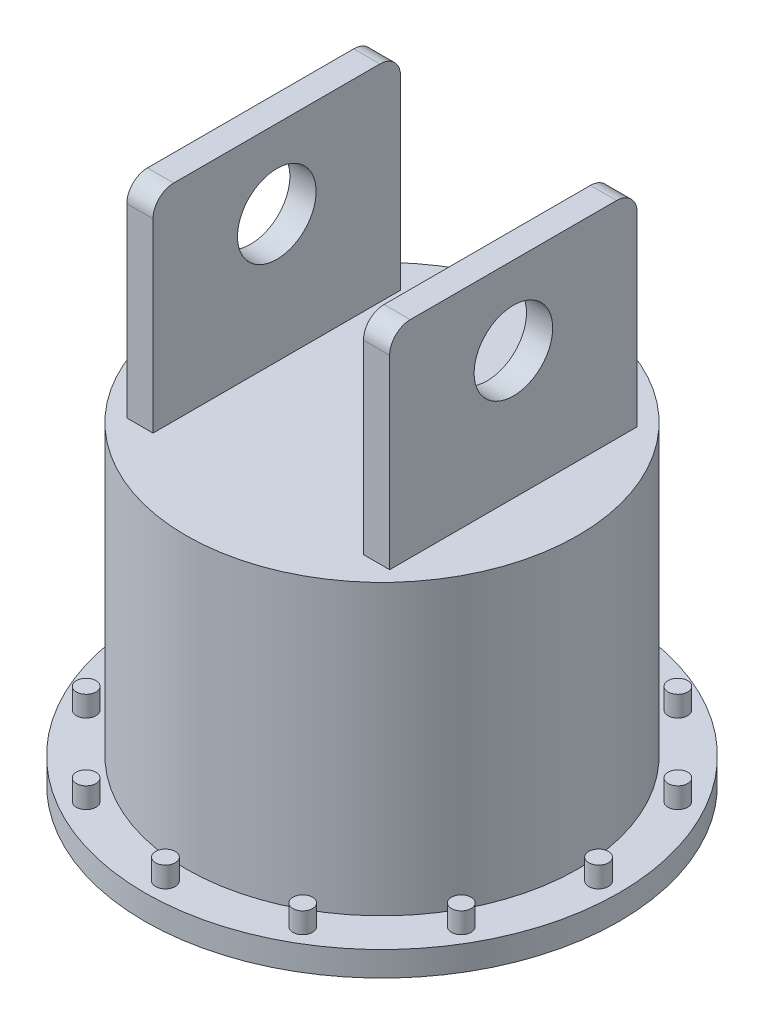
ISO-10303-21;
HEADER;
FILE_DESCRIPTION(('STEP AP214'),'2;1');
FILE_NAME('part.step','',(''),(''),'','','');
FILE_SCHEMA(('AUTOMOTIVE_DESIGN { 1 0 10303 214 1 1 1 1 }'));
ENDSEC;
DATA;
#1=APPLICATION_CONTEXT('core data for automotive mechanical design processes');
#2=APPLICATION_PROTOCOL_DEFINITION('international standard','automotive_design',2000,#1);
#3=PRODUCT_CONTEXT('',#1,'mechanical');
#4=PRODUCT('Part','Part','',(#3));
#5=PRODUCT_RELATED_PRODUCT_CATEGORY('part','',(#4));
#6=PRODUCT_DEFINITION_FORMATION('','',#4);
#7=PRODUCT_DEFINITION_CONTEXT('part definition',#1,'design');
#8=PRODUCT_DEFINITION('design','',#6,#7);
#9=PRODUCT_DEFINITION_SHAPE('','',#8);
#10=(LENGTH_UNIT() NAMED_UNIT(*) SI_UNIT(.MILLI.,.METRE.));
#11=(NAMED_UNIT(*) PLANE_ANGLE_UNIT() SI_UNIT($,.RADIAN.));
#12=(NAMED_UNIT(*) SI_UNIT($,.STERADIAN.) SOLID_ANGLE_UNIT());
#13=UNCERTAINTY_MEASURE_WITH_UNIT(LENGTH_MEASURE(1.E-05),#10,'distance_accuracy_value','');
#14=(GEOMETRIC_REPRESENTATION_CONTEXT(3) GLOBAL_UNCERTAINTY_ASSIGNED_CONTEXT((#13)) GLOBAL_UNIT_ASSIGNED_CONTEXT((#10,
#11,#12)) REPRESENTATION_CONTEXT('',''));
#15=CARTESIAN_POINT('',(0.,0.,0.));
#16=DIRECTION('',(0.,0.,1.));
#17=DIRECTION('',(1.,0.,0.));
#18=AXIS2_PLACEMENT_3D('',#15,#16,#17);
#19=CARTESIAN_POINT('',(0.,152.,0.));
#20=DIRECTION('',(0.,1.,0.));
#21=DIRECTION('',(0.,0.,1.));
#22=AXIS2_PLACEMENT_3D('',#19,#20,#21);
#23=PLANE('',#22);
#24=CARTESIAN_POINT('',(0.,152.,0.));
#25=DIRECTION('',(0.,1.,0.));
#26=DIRECTION('',(0.,0.,1.));
#27=AXIS2_PLACEMENT_3D('',#24,#25,#26);
#28=CIRCLE('',#27,95.);
#29=CARTESIAN_POINT('',(0.,152.,95.));
#30=VERTEX_POINT('',#29);
#31=EDGE_CURVE('E256',#30,#30,#28,.T.);
#32=ORIENTED_EDGE('',*,*,#31,.T.);
#33=EDGE_LOOP('',(#32));
#34=FACE_BOUND('',#33,.T.);
#35=DIRECTION('',(1.,0.,0.));
#36=VECTOR('',#35,1.);
#37=CARTESIAN_POINT('',(63.7,152.,59.9999999999999));
#38=LINE('',#37,#36);
#39=CARTESIAN_POINT('',(51.,152.,59.9999999999999));
#40=VERTEX_POINT('',#39);
#41=CARTESIAN_POINT('',(63.7,152.,59.9999999999999));
#42=VERTEX_POINT('',#41);
#43=EDGE_CURVE('E168',#40,#42,#38,.T.);
#44=ORIENTED_EDGE('',*,*,#43,.F.);
#45=DIRECTION('',(0.,0.,1.));
#46=VECTOR('',#45,1.);
#47=CARTESIAN_POINT('',(51.,152.,59.9999999999999));
#48=LINE('',#47,#46);
#49=CARTESIAN_POINT('',(51.,152.,-60.0000000000001));
#50=VERTEX_POINT('',#49);
#51=EDGE_CURVE('E131',#50,#40,#48,.T.);
#52=ORIENTED_EDGE('',*,*,#51,.F.);
#53=DIRECTION('',(-1.,0.,0.));
#54=VECTOR('',#53,1.);
#55=CARTESIAN_POINT('',(63.7,152.,-60.0000000000001));
#56=LINE('',#55,#54);
#57=CARTESIAN_POINT('',(63.7,152.,-60.0000000000001));
#58=VERTEX_POINT('',#57);
#59=EDGE_CURVE('E162',#58,#50,#56,.T.);
#60=ORIENTED_EDGE('',*,*,#59,.F.);
#61=DIRECTION('',(0.,0.,-1.));
#62=VECTOR('',#61,1.);
#63=CARTESIAN_POINT('',(63.7,152.,59.9999999999999));
#64=LINE('',#63,#62);
#65=EDGE_CURVE('E171',#42,#58,#64,.T.);
#66=ORIENTED_EDGE('',*,*,#65,.F.);
#67=EDGE_LOOP('',(#44,#52,#60,#66));
#68=FACE_BOUND('',#67,.T.);
#69=DIRECTION('',(1.,0.,0.));
#70=VECTOR('',#69,1.);
#71=CARTESIAN_POINT('',(-63.7,152.,59.9999999999999));
#72=LINE('',#71,#70);
#73=CARTESIAN_POINT('',(-63.7,152.,59.9999999999999));
#74=VERTEX_POINT('',#73);
#75=CARTESIAN_POINT('',(-51.,152.,59.9999999999999));
#76=VERTEX_POINT('',#75);
#77=EDGE_CURVE('E126',#74,#76,#72,.T.);
#78=ORIENTED_EDGE('',*,*,#77,.F.);
#79=DIRECTION('',(0.,0.,1.));
#80=VECTOR('',#79,1.);
#81=CARTESIAN_POINT('',(-63.7,152.,59.9999999999999));
#82=LINE('',#81,#80);
#83=CARTESIAN_POINT('',(-63.7,152.,-60.0000000000001));
#84=VERTEX_POINT('',#83);
#85=EDGE_CURVE('E135',#84,#74,#82,.T.);
#86=ORIENTED_EDGE('',*,*,#85,.F.);
#87=DIRECTION('',(-1.,0.,0.));
#88=VECTOR('',#87,1.);
#89=CARTESIAN_POINT('',(-63.7,152.,-60.0000000000001));
#90=LINE('',#89,#88);
#91=CARTESIAN_POINT('',(-51.,152.,-60.0000000000001));
#92=VERTEX_POINT('',#91);
#93=EDGE_CURVE('E147',#92,#84,#90,.T.);
#94=ORIENTED_EDGE('',*,*,#93,.F.);
#95=DIRECTION('',(0.,0.,-1.));
#96=VECTOR('',#95,1.);
#97=CARTESIAN_POINT('',(-51.,152.,59.9999999999999));
#98=LINE('',#97,#96);
#99=EDGE_CURVE('E145',#76,#92,#98,.T.);
#100=ORIENTED_EDGE('',*,*,#99,.F.);
#101=EDGE_LOOP('',(#78,#86,#94,#100));
#102=FACE_BOUND('',#101,.T.);
#103=ADVANCED_FACE('F33',(#34,#68,#102),#23,.T.);
#104=CARTESIAN_POINT('',(0.,12.,0.));
#105=DIRECTION('',(0.,-1.,0.));
#106=DIRECTION('',(0.,0.,-1.));
#107=AXIS2_PLACEMENT_3D('',#104,#105,#106);
#108=CYLINDRICAL_SURFACE('',#107,115.);
#109=CARTESIAN_POINT('',(0.,12.,0.));
#110=DIRECTION('',(0.,1.,0.));
#111=DIRECTION('',(0.,0.,1.));
#112=AXIS2_PLACEMENT_3D('',#109,#110,#111);
#113=CIRCLE('',#112,115.);
#114=CARTESIAN_POINT('',(0.,12.,115.));
#115=VERTEX_POINT('',#114);
#116=EDGE_CURVE('E262',#115,#115,#113,.T.);
#117=ORIENTED_EDGE('',*,*,#116,.F.);
#118=EDGE_LOOP('',(#117));
#119=FACE_BOUND('',#118,.T.);
#120=CARTESIAN_POINT('',(0.,0.,0.));
#121=DIRECTION('',(0.,1.,0.));
#122=DIRECTION('',(0.,0.,1.));
#123=AXIS2_PLACEMENT_3D('',#120,#121,#122);
#124=CIRCLE('',#123,115.);
#125=CARTESIAN_POINT('',(0.,0.,115.));
#126=VERTEX_POINT('',#125);
#127=EDGE_CURVE('E259',#126,#126,#124,.T.);
#128=ORIENTED_EDGE('',*,*,#127,.T.);
#129=EDGE_LOOP('',(#128));
#130=FACE_BOUND('',#129,.T.);
#131=ADVANCED_FACE('F337',(#119,#130),#108,.T.);
#132=CARTESIAN_POINT('',(0.,12.,0.));
#133=DIRECTION('',(0.,1.,0.));
#134=DIRECTION('',(0.,0.,1.));
#135=AXIS2_PLACEMENT_3D('',#132,#133,#134);
#136=PLANE('',#135);
#137=CARTESIAN_POINT('',(52.4999999999988,12.,-90.9326673973667));
#138=DIRECTION('',(0.,1.,0.));
#139=DIRECTION('',(-0.499999999999989,0.,0.866025403784445));
#140=AXIS2_PLACEMENT_3D('',#137,#138,#139);
#141=CIRCLE('',#140,4.7625);
#142=CARTESIAN_POINT('',(50.1187499999989,12.,-86.8082214118433));
#143=VERTEX_POINT('',#142);
#144=EDGE_CURVE('E183',#143,#143,#141,.T.);
#145=ORIENTED_EDGE('',*,*,#144,.F.);
#146=EDGE_LOOP('',(#145));
#147=FACE_BOUND('',#146,.T.);
#148=CARTESIAN_POINT('',(90.9326673973654,12.,-52.5000000000011));
#149=DIRECTION('',(0.,1.,0.));
#150=DIRECTION('',(-0.866025403784433,0.,0.50000000000001));
#151=AXIS2_PLACEMENT_3D('',#148,#149,#150);
#152=CIRCLE('',#151,4.7625);
#153=CARTESIAN_POINT('',(86.8082214118421,12.,-50.118750000001));
#154=VERTEX_POINT('',#153);
#155=EDGE_CURVE('E187',#154,#154,#152,.T.);
#156=ORIENTED_EDGE('',*,*,#155,.F.);
#157=EDGE_LOOP('',(#156));
#158=FACE_BOUND('',#157,.T.);
#159=CARTESIAN_POINT('',(105.,12.,-1.09981662173559E-12));
#160=DIRECTION('',(0.,1.,0.));
#161=DIRECTION('',(-1.,0.,0.));
#162=AXIS2_PLACEMENT_3D('',#159,#160,#161);
#163=CIRCLE('',#162,4.7625);
#164=CARTESIAN_POINT('',(100.2375,12.,-1.04993208210687E-12));
#165=VERTEX_POINT('',#164);
#166=EDGE_CURVE('E193',#165,#165,#163,.T.);
#167=ORIENTED_EDGE('',*,*,#166,.F.);
#168=EDGE_LOOP('',(#167));
#169=FACE_BOUND('',#168,.T.);
#170=CARTESIAN_POINT('',(90.9326673973666,12.,52.4999999999992));
#171=DIRECTION('',(0.,1.,0.));
#172=DIRECTION('',(-0.866025403784443,0.,-0.499999999999992));
#173=AXIS2_PLACEMENT_3D('',#170,#171,#172);
#174=CIRCLE('',#173,4.7625);
#175=CARTESIAN_POINT('',(86.8082214118431,12.,50.1187499999992));
#176=VERTEX_POINT('',#175);
#177=EDGE_CURVE('E199',#176,#176,#174,.T.);
#178=ORIENTED_EDGE('',*,*,#177,.F.);
#179=EDGE_LOOP('',(#178));
#180=FACE_BOUND('',#179,.T.);
#181=CARTESIAN_POINT('',(52.5000000000008,12.,90.9326673973656));
#182=DIRECTION('',(0.,1.,0.));
#183=DIRECTION('',(-0.500000000000007,0.,-0.866025403784435));
#184=AXIS2_PLACEMENT_3D('',#181,#182,#183);
#185=CIRCLE('',#184,4.7625);
#186=CARTESIAN_POINT('',(50.1187500000007,12.,86.8082214118423));
#187=VERTEX_POINT('',#186);
#188=EDGE_CURVE('E205',#187,#187,#185,.T.);
#189=ORIENTED_EDGE('',*,*,#188,.F.);
#190=EDGE_LOOP('',(#189));
#191=FACE_BOUND('',#190,.T.);
#192=CARTESIAN_POINT('',(0.,12.,105.));
#193=DIRECTION('',(0.,1.,0.));
#194=DIRECTION('',(0.,0.,-1.));
#195=AXIS2_PLACEMENT_3D('',#192,#193,#194);
#196=CIRCLE('',#195,4.7625);
#197=CARTESIAN_POINT('',(0.,12.,100.2375));
#198=VERTEX_POINT('',#197);
#199=EDGE_CURVE('E211',#198,#198,#196,.T.);
#200=ORIENTED_EDGE('',*,*,#199,.F.);
#201=EDGE_LOOP('',(#200));
#202=FACE_BOUND('',#201,.T.);
#203=CARTESIAN_POINT('',(-52.4999999999995,12.,90.9326673973664));
#204=DIRECTION('',(0.,1.,0.));
#205=DIRECTION('',(0.499999999999995,0.,-0.866025403784442));
#206=AXIS2_PLACEMENT_3D('',#203,#204,#205);
#207=CIRCLE('',#206,4.7625);
#208=CARTESIAN_POINT('',(-50.1187499999995,12.,86.808221411843));
#209=VERTEX_POINT('',#208);
#210=EDGE_CURVE('E217',#209,#209,#207,.T.);
#211=ORIENTED_EDGE('',*,*,#210,.F.);
#212=EDGE_LOOP('',(#211));
#213=FACE_BOUND('',#212,.T.);
#214=CARTESIAN_POINT('',(-90.9326673973658,12.,52.5000000000004));
#215=DIRECTION('',(0.,1.,0.));
#216=DIRECTION('',(0.866025403784436,0.,-0.500000000000004));
#217=AXIS2_PLACEMENT_3D('',#214,#215,#216);
#218=CIRCLE('',#217,4.7625);
#219=CARTESIAN_POINT('',(-86.8082214118425,12.,50.1187500000004));
#220=VERTEX_POINT('',#219);
#221=EDGE_CURVE('E223',#220,#220,#218,.T.);
#222=ORIENTED_EDGE('',*,*,#221,.F.);
#223=EDGE_LOOP('',(#222));
#224=FACE_BOUND('',#223,.T.);
#225=CARTESIAN_POINT('',(-105.,12.,3.66605540578529E-13));
#226=DIRECTION('',(0.,1.,0.));
#227=DIRECTION('',(1.,0.,0.));
#228=AXIS2_PLACEMENT_3D('',#225,#226,#227);
#229=CIRCLE('',#228,4.7625);
#230=CARTESIAN_POINT('',(-100.2375,12.,3.49977360702289E-13));
#231=VERTEX_POINT('',#230);
#232=EDGE_CURVE('E229',#231,#231,#229,.T.);
#233=ORIENTED_EDGE('',*,*,#232,.F.);
#234=EDGE_LOOP('',(#233));
#235=FACE_BOUND('',#234,.T.);
#236=CARTESIAN_POINT('',(-90.9326673973662,12.,-52.4999999999998));
#237=DIRECTION('',(0.,1.,0.));
#238=DIRECTION('',(0.86602540378444,0.,0.499999999999998));
#239=AXIS2_PLACEMENT_3D('',#236,#237,#238);
#240=CIRCLE('',#239,4.7625);
#241=CARTESIAN_POINT('',(-86.8082214118428,12.,-50.1187499999998));
#242=VERTEX_POINT('',#241);
#243=EDGE_CURVE('E235',#242,#242,#240,.T.);
#244=ORIENTED_EDGE('',*,*,#243,.F.);
#245=EDGE_LOOP('',(#244));
#246=FACE_BOUND('',#245,.T.);
#247=CARTESIAN_POINT('',(-52.5000000000001,12.,-90.932667397366));
#248=DIRECTION('',(0.,1.,0.));
#249=DIRECTION('',(0.500000000000001,0.,0.866025403784438));
#250=AXIS2_PLACEMENT_3D('',#247,#248,#249);
#251=CIRCLE('',#250,4.7625);
#252=CARTESIAN_POINT('',(-50.1187500000001,12.,-86.8082214118426));
#253=VERTEX_POINT('',#252);
#254=EDGE_CURVE('E241',#253,#253,#251,.T.);
#255=ORIENTED_EDGE('',*,*,#254,.F.);
#256=EDGE_LOOP('',(#255));
#257=FACE_BOUND('',#256,.T.);
#258=CARTESIAN_POINT('',(0.,12.,-105.));
#259=DIRECTION('',(0.,1.,0.));
#260=DIRECTION('',(0.,0.,1.));
#261=AXIS2_PLACEMENT_3D('',#258,#259,#260);
#262=CIRCLE('',#261,4.7625);
#263=CARTESIAN_POINT('',(0.,12.,-100.2375));
#264=VERTEX_POINT('',#263);
#265=EDGE_CURVE('E247',#264,#264,#262,.T.);
#266=ORIENTED_EDGE('',*,*,#265,.F.);
#267=EDGE_LOOP('',(#266));
#268=FACE_BOUND('',#267,.T.);
#269=CARTESIAN_POINT('',(0.,12.,0.));
#270=DIRECTION('',(0.,1.,0.));
#271=DIRECTION('',(0.,0.,1.));
#272=AXIS2_PLACEMENT_3D('',#269,#270,#271);
#273=CIRCLE('',#272,95.);
#274=CARTESIAN_POINT('',(0.,12.,95.));
#275=VERTEX_POINT('',#274);
#276=EDGE_CURVE('E253',#275,#275,#273,.T.);
#277=ORIENTED_EDGE('',*,*,#276,.F.);
#278=EDGE_LOOP('',(#277));
#279=FACE_BOUND('',#278,.T.);
#280=ORIENTED_EDGE('',*,*,#116,.T.);
#281=EDGE_LOOP('',(#280));
#282=FACE_BOUND('',#281,.T.);
#283=ADVANCED_FACE('F343',(#147,#158,#169,#180,#191,#202,#213,#224,#235,#246,#257,#268,#279,
#282),#136,.T.);
#284=CARTESIAN_POINT('',(0.,0.,0.));
#285=DIRECTION('',(0.,1.,0.));
#286=DIRECTION('',(0.,0.,1.));
#287=AXIS2_PLACEMENT_3D('',#284,#285,#286);
#288=PLANE('',#287);
#289=ORIENTED_EDGE('',*,*,#127,.F.);
#290=EDGE_LOOP('',(#289));
#291=FACE_BOUND('',#290,.T.);
#292=ADVANCED_FACE('F354',(#291),#288,.F.);
#293=CARTESIAN_POINT('',(0.,152.,0.));
#294=DIRECTION('',(0.,-1.,0.));
#295=DIRECTION('',(0.,0.,-1.));
#296=AXIS2_PLACEMENT_3D('',#293,#294,#295);
#297=CYLINDRICAL_SURFACE('',#296,95.);
#298=ORIENTED_EDGE('',*,*,#31,.F.);
#299=EDGE_LOOP('',(#298));
#300=FACE_BOUND('',#299,.T.);
#301=ORIENTED_EDGE('',*,*,#276,.T.);
#302=EDGE_LOOP('',(#301));
#303=FACE_BOUND('',#302,.T.);
#304=ADVANCED_FACE('F351',(#300,#303),#297,.T.);
#305=CARTESIAN_POINT('',(0.,22.,-105.));
#306=DIRECTION('',(0.,-1.,0.));
#307=DIRECTION('',(0.,0.,-1.));
#308=AXIS2_PLACEMENT_3D('',#305,#306,#307);
#309=CYLINDRICAL_SURFACE('',#308,4.7625);
#310=CARTESIAN_POINT('',(0.,22.,-105.));
#311=DIRECTION('',(0.,1.,0.));
#312=DIRECTION('',(0.,0.,1.));
#313=AXIS2_PLACEMENT_3D('',#310,#311,#312);
#314=CIRCLE('',#313,4.7625);
#315=CARTESIAN_POINT('',(0.,22.,-100.2375));
#316=VERTEX_POINT('',#315);
#317=EDGE_CURVE('E250',#316,#316,#314,.T.);
#318=ORIENTED_EDGE('',*,*,#317,.F.);
#319=EDGE_LOOP('',(#318));
#320=FACE_BOUND('',#319,.T.);
#321=ORIENTED_EDGE('',*,*,#265,.T.);
#322=EDGE_LOOP('',(#321));
#323=FACE_BOUND('',#322,.T.);
#324=ADVANCED_FACE('F349',(#320,#323),#309,.T.);
#325=CARTESIAN_POINT('',(0.,22.,-105.));
#326=DIRECTION('',(0.,1.,0.));
#327=DIRECTION('',(0.,0.,1.));
#328=AXIS2_PLACEMENT_3D('',#325,#326,#327);
#329=PLANE('',#328);
#330=ORIENTED_EDGE('',*,*,#317,.T.);
#331=EDGE_LOOP('',(#330));
#332=FACE_BOUND('',#331,.T.);
#333=ADVANCED_FACE('F648',(#332),#329,.T.);
#334=CARTESIAN_POINT('',(-52.5000000000001,22.,-90.932667397366));
#335=DIRECTION('',(0.,-1.,0.));
#336=DIRECTION('',(0.,0.,-1.));
#337=AXIS2_PLACEMENT_3D('',#334,#335,#336);
#338=CYLINDRICAL_SURFACE('',#337,4.7625);
#339=CARTESIAN_POINT('',(-52.5000000000001,22.,-90.932667397366));
#340=DIRECTION('',(0.,1.,0.));
#341=DIRECTION('',(0.500000000000001,0.,0.866025403784438));
#342=AXIS2_PLACEMENT_3D('',#339,#340,#341);
#343=CIRCLE('',#342,4.7625);
#344=CARTESIAN_POINT('',(-50.1187500000001,22.,-86.8082214118426));
#345=VERTEX_POINT('',#344);
#346=EDGE_CURVE('E244',#345,#345,#343,.T.);
#347=ORIENTED_EDGE('',*,*,#346,.F.);
#348=EDGE_LOOP('',(#347));
#349=FACE_BOUND('',#348,.T.);
#350=ORIENTED_EDGE('',*,*,#254,.T.);
#351=EDGE_LOOP('',(#350));
#352=FACE_BOUND('',#351,.T.);
#353=ADVANCED_FACE('F640',(#349,#352),#338,.T.);
#354=CARTESIAN_POINT('',(-52.5000000000001,22.,-90.932667397366));
#355=DIRECTION('',(0.,1.,0.));
#356=DIRECTION('',(0.500000000000001,0.,0.866025403784438));
#357=AXIS2_PLACEMENT_3D('',#354,#355,#356);
#358=PLANE('',#357);
#359=ORIENTED_EDGE('',*,*,#346,.T.);
#360=EDGE_LOOP('',(#359));
#361=FACE_BOUND('',#360,.T.);
#362=ADVANCED_FACE('F632',(#361),#358,.T.);
#363=CARTESIAN_POINT('',(-90.9326673973662,22.,-52.4999999999998));
#364=DIRECTION('',(0.,-1.,0.));
#365=DIRECTION('',(0.,0.,-1.));
#366=AXIS2_PLACEMENT_3D('',#363,#364,#365);
#367=CYLINDRICAL_SURFACE('',#366,4.7625);
#368=CARTESIAN_POINT('',(-90.9326673973662,22.,-52.4999999999998));
#369=DIRECTION('',(0.,1.,0.));
#370=DIRECTION('',(0.86602540378444,0.,0.499999999999998));
#371=AXIS2_PLACEMENT_3D('',#368,#369,#370);
#372=CIRCLE('',#371,4.7625);
#373=CARTESIAN_POINT('',(-86.8082214118428,22.,-50.1187499999998));
#374=VERTEX_POINT('',#373);
#375=EDGE_CURVE('E238',#374,#374,#372,.T.);
#376=ORIENTED_EDGE('',*,*,#375,.F.);
#377=EDGE_LOOP('',(#376));
#378=FACE_BOUND('',#377,.T.);
#379=ORIENTED_EDGE('',*,*,#243,.T.);
#380=EDGE_LOOP('',(#379));
#381=FACE_BOUND('',#380,.T.);
#382=ADVANCED_FACE('F624',(#378,#381),#367,.T.);
#383=CARTESIAN_POINT('',(-90.9326673973662,22.,-52.4999999999998));
#384=DIRECTION('',(0.,1.,0.));
#385=DIRECTION('',(0.86602540378444,0.,0.499999999999998));
#386=AXIS2_PLACEMENT_3D('',#383,#384,#385);
#387=PLANE('',#386);
#388=ORIENTED_EDGE('',*,*,#375,.T.);
#389=EDGE_LOOP('',(#388));
#390=FACE_BOUND('',#389,.T.);
#391=ADVANCED_FACE('F616',(#390),#387,.T.);
#392=CARTESIAN_POINT('',(-105.,22.,3.66605540578529E-13));
#393=DIRECTION('',(0.,-1.,0.));
#394=DIRECTION('',(0.,0.,-1.));
#395=AXIS2_PLACEMENT_3D('',#392,#393,#394);
#396=CYLINDRICAL_SURFACE('',#395,4.7625);
#397=CARTESIAN_POINT('',(-105.,22.,3.66605540578529E-13));
#398=DIRECTION('',(0.,1.,0.));
#399=DIRECTION('',(1.,0.,0.));
#400=AXIS2_PLACEMENT_3D('',#397,#398,#399);
#401=CIRCLE('',#400,4.7625);
#402=CARTESIAN_POINT('',(-100.2375,22.,3.49977360702289E-13));
#403=VERTEX_POINT('',#402);
#404=EDGE_CURVE('E232',#403,#403,#401,.T.);
#405=ORIENTED_EDGE('',*,*,#404,.F.);
#406=EDGE_LOOP('',(#405));
#407=FACE_BOUND('',#406,.T.);
#408=ORIENTED_EDGE('',*,*,#232,.T.);
#409=EDGE_LOOP('',(#408));
#410=FACE_BOUND('',#409,.T.);
#411=ADVANCED_FACE('F608',(#407,#410),#396,.T.);
#412=CARTESIAN_POINT('',(-105.,22.,3.66605540578529E-13));
#413=DIRECTION('',(0.,1.,0.));
#414=DIRECTION('',(1.,0.,0.));
#415=AXIS2_PLACEMENT_3D('',#412,#413,#414);
#416=PLANE('',#415);
#417=ORIENTED_EDGE('',*,*,#404,.T.);
#418=EDGE_LOOP('',(#417));
#419=FACE_BOUND('',#418,.T.);
#420=ADVANCED_FACE('F600',(#419),#416,.T.);
#421=CARTESIAN_POINT('',(-90.9326673973658,22.,52.5000000000004));
#422=DIRECTION('',(0.,-1.,0.));
#423=DIRECTION('',(0.,0.,-1.));
#424=AXIS2_PLACEMENT_3D('',#421,#422,#423);
#425=CYLINDRICAL_SURFACE('',#424,4.7625);
#426=CARTESIAN_POINT('',(-90.9326673973658,22.,52.5000000000004));
#427=DIRECTION('',(0.,1.,0.));
#428=DIRECTION('',(0.866025403784436,0.,-0.500000000000004));
#429=AXIS2_PLACEMENT_3D('',#426,#427,#428);
#430=CIRCLE('',#429,4.7625);
#431=CARTESIAN_POINT('',(-86.8082214118425,22.,50.1187500000004));
#432=VERTEX_POINT('',#431);
#433=EDGE_CURVE('E226',#432,#432,#430,.T.);
#434=ORIENTED_EDGE('',*,*,#433,.F.);
#435=EDGE_LOOP('',(#434));
#436=FACE_BOUND('',#435,.T.);
#437=ORIENTED_EDGE('',*,*,#221,.T.);
#438=EDGE_LOOP('',(#437));
#439=FACE_BOUND('',#438,.T.);
#440=ADVANCED_FACE('F592',(#436,#439),#425,.T.);
#441=CARTESIAN_POINT('',(-90.9326673973658,22.,52.5000000000004));
#442=DIRECTION('',(0.,1.,0.));
#443=DIRECTION('',(0.866025403784436,0.,-0.500000000000004));
#444=AXIS2_PLACEMENT_3D('',#441,#442,#443);
#445=PLANE('',#444);
#446=ORIENTED_EDGE('',*,*,#433,.T.);
#447=EDGE_LOOP('',(#446));
#448=FACE_BOUND('',#447,.T.);
#449=ADVANCED_FACE('F584',(#448),#445,.T.);
#450=CARTESIAN_POINT('',(-52.4999999999995,22.,90.9326673973664));
#451=DIRECTION('',(0.,-1.,0.));
#452=DIRECTION('',(0.,0.,-1.));
#453=AXIS2_PLACEMENT_3D('',#450,#451,#452);
#454=CYLINDRICAL_SURFACE('',#453,4.7625);
#455=CARTESIAN_POINT('',(-52.4999999999995,22.,90.9326673973664));
#456=DIRECTION('',(0.,1.,0.));
#457=DIRECTION('',(0.499999999999995,0.,-0.866025403784442));
#458=AXIS2_PLACEMENT_3D('',#455,#456,#457);
#459=CIRCLE('',#458,4.7625);
#460=CARTESIAN_POINT('',(-50.1187499999995,22.,86.808221411843));
#461=VERTEX_POINT('',#460);
#462=EDGE_CURVE('E220',#461,#461,#459,.T.);
#463=ORIENTED_EDGE('',*,*,#462,.F.);
#464=EDGE_LOOP('',(#463));
#465=FACE_BOUND('',#464,.T.);
#466=ORIENTED_EDGE('',*,*,#210,.T.);
#467=EDGE_LOOP('',(#466));
#468=FACE_BOUND('',#467,.T.);
#469=ADVANCED_FACE('F576',(#465,#468),#454,.T.);
#470=CARTESIAN_POINT('',(-52.4999999999995,22.,90.9326673973664));
#471=DIRECTION('',(0.,1.,0.));
#472=DIRECTION('',(0.499999999999995,0.,-0.866025403784442));
#473=AXIS2_PLACEMENT_3D('',#470,#471,#472);
#474=PLANE('',#473);
#475=ORIENTED_EDGE('',*,*,#462,.T.);
#476=EDGE_LOOP('',(#475));
#477=FACE_BOUND('',#476,.T.);
#478=ADVANCED_FACE('F568',(#477),#474,.T.);
#479=CARTESIAN_POINT('',(0.,22.,105.));
#480=DIRECTION('',(0.,-1.,0.));
#481=DIRECTION('',(0.,0.,-1.));
#482=AXIS2_PLACEMENT_3D('',#479,#480,#481);
#483=CYLINDRICAL_SURFACE('',#482,4.7625);
#484=CARTESIAN_POINT('',(0.,22.,105.));
#485=DIRECTION('',(0.,1.,0.));
#486=DIRECTION('',(0.,0.,-1.));
#487=AXIS2_PLACEMENT_3D('',#484,#485,#486);
#488=CIRCLE('',#487,4.7625);
#489=CARTESIAN_POINT('',(0.,22.,100.2375));
#490=VERTEX_POINT('',#489);
#491=EDGE_CURVE('E214',#490,#490,#488,.T.);
#492=ORIENTED_EDGE('',*,*,#491,.F.);
#493=EDGE_LOOP('',(#492));
#494=FACE_BOUND('',#493,.T.);
#495=ORIENTED_EDGE('',*,*,#199,.T.);
#496=EDGE_LOOP('',(#495));
#497=FACE_BOUND('',#496,.T.);
#498=ADVANCED_FACE('F560',(#494,#497),#483,.T.);
#499=CARTESIAN_POINT('',(0.,22.,105.));
#500=DIRECTION('',(0.,1.,0.));
#501=DIRECTION('',(0.,0.,-1.));
#502=AXIS2_PLACEMENT_3D('',#499,#500,#501);
#503=PLANE('',#502);
#504=ORIENTED_EDGE('',*,*,#491,.T.);
#505=EDGE_LOOP('',(#504));
#506=FACE_BOUND('',#505,.T.);
#507=ADVANCED_FACE('F552',(#506),#503,.T.);
#508=CARTESIAN_POINT('',(52.5000000000008,22.,90.9326673973656));
#509=DIRECTION('',(0.,-1.,0.));
#510=DIRECTION('',(0.,0.,-1.));
#511=AXIS2_PLACEMENT_3D('',#508,#509,#510);
#512=CYLINDRICAL_SURFACE('',#511,4.7625);
#513=CARTESIAN_POINT('',(52.5000000000008,22.,90.9326673973656));
#514=DIRECTION('',(0.,1.,0.));
#515=DIRECTION('',(-0.500000000000007,0.,-0.866025403784435));
#516=AXIS2_PLACEMENT_3D('',#513,#514,#515);
#517=CIRCLE('',#516,4.7625);
#518=CARTESIAN_POINT('',(50.1187500000007,22.,86.8082214118423));
#519=VERTEX_POINT('',#518);
#520=EDGE_CURVE('E208',#519,#519,#517,.T.);
#521=ORIENTED_EDGE('',*,*,#520,.F.);
#522=EDGE_LOOP('',(#521));
#523=FACE_BOUND('',#522,.T.);
#524=ORIENTED_EDGE('',*,*,#188,.T.);
#525=EDGE_LOOP('',(#524));
#526=FACE_BOUND('',#525,.T.);
#527=ADVANCED_FACE('F544',(#523,#526),#512,.T.);
#528=CARTESIAN_POINT('',(52.5000000000008,22.,90.9326673973656));
#529=DIRECTION('',(0.,1.,0.));
#530=DIRECTION('',(-0.500000000000007,0.,-0.866025403784435));
#531=AXIS2_PLACEMENT_3D('',#528,#529,#530);
#532=PLANE('',#531);
#533=ORIENTED_EDGE('',*,*,#520,.T.);
#534=EDGE_LOOP('',(#533));
#535=FACE_BOUND('',#534,.T.);
#536=ADVANCED_FACE('F536',(#535),#532,.T.);
#537=CARTESIAN_POINT('',(90.9326673973666,22.,52.4999999999992));
#538=DIRECTION('',(0.,-1.,0.));
#539=DIRECTION('',(0.,0.,-1.));
#540=AXIS2_PLACEMENT_3D('',#537,#538,#539);
#541=CYLINDRICAL_SURFACE('',#540,4.7625);
#542=CARTESIAN_POINT('',(90.9326673973666,22.,52.4999999999992));
#543=DIRECTION('',(0.,1.,0.));
#544=DIRECTION('',(-0.866025403784443,0.,-0.499999999999992));
#545=AXIS2_PLACEMENT_3D('',#542,#543,#544);
#546=CIRCLE('',#545,4.7625);
#547=CARTESIAN_POINT('',(86.8082214118431,22.,50.1187499999992));
#548=VERTEX_POINT('',#547);
#549=EDGE_CURVE('E202',#548,#548,#546,.T.);
#550=ORIENTED_EDGE('',*,*,#549,.F.);
#551=EDGE_LOOP('',(#550));
#552=FACE_BOUND('',#551,.T.);
#553=ORIENTED_EDGE('',*,*,#177,.T.);
#554=EDGE_LOOP('',(#553));
#555=FACE_BOUND('',#554,.T.);
#556=ADVANCED_FACE('F528',(#552,#555),#541,.T.);
#557=CARTESIAN_POINT('',(90.9326673973666,22.,52.4999999999992));
#558=DIRECTION('',(0.,1.,0.));
#559=DIRECTION('',(-0.866025403784443,0.,-0.499999999999992));
#560=AXIS2_PLACEMENT_3D('',#557,#558,#559);
#561=PLANE('',#560);
#562=ORIENTED_EDGE('',*,*,#549,.T.);
#563=EDGE_LOOP('',(#562));
#564=FACE_BOUND('',#563,.T.);
#565=ADVANCED_FACE('F520',(#564),#561,.T.);
#566=CARTESIAN_POINT('',(105.,22.,-1.09981662173559E-12));
#567=DIRECTION('',(0.,-1.,0.));
#568=DIRECTION('',(0.,0.,-1.));
#569=AXIS2_PLACEMENT_3D('',#566,#567,#568);
#570=CYLINDRICAL_SURFACE('',#569,4.7625);
#571=CARTESIAN_POINT('',(105.,22.,-1.09981662173559E-12));
#572=DIRECTION('',(0.,1.,0.));
#573=DIRECTION('',(-1.,0.,0.));
#574=AXIS2_PLACEMENT_3D('',#571,#572,#573);
#575=CIRCLE('',#574,4.7625);
#576=CARTESIAN_POINT('',(100.2375,22.,-1.04993208210687E-12));
#577=VERTEX_POINT('',#576);
#578=EDGE_CURVE('E196',#577,#577,#575,.T.);
#579=ORIENTED_EDGE('',*,*,#578,.F.);
#580=EDGE_LOOP('',(#579));
#581=FACE_BOUND('',#580,.T.);
#582=ORIENTED_EDGE('',*,*,#166,.T.);
#583=EDGE_LOOP('',(#582));
#584=FACE_BOUND('',#583,.T.);
#585=ADVANCED_FACE('F512',(#581,#584),#570,.T.);
#586=CARTESIAN_POINT('',(105.,22.,-1.09981662173559E-12));
#587=DIRECTION('',(0.,1.,0.));
#588=DIRECTION('',(-1.,0.,0.));
#589=AXIS2_PLACEMENT_3D('',#586,#587,#588);
#590=PLANE('',#589);
#591=ORIENTED_EDGE('',*,*,#578,.T.);
#592=EDGE_LOOP('',(#591));
#593=FACE_BOUND('',#592,.T.);
#594=ADVANCED_FACE('F504',(#593),#590,.T.);
#595=CARTESIAN_POINT('',(90.9326673973654,22.,-52.5000000000011));
#596=DIRECTION('',(0.,-1.,0.));
#597=DIRECTION('',(0.,0.,-1.));
#598=AXIS2_PLACEMENT_3D('',#595,#596,#597);
#599=CYLINDRICAL_SURFACE('',#598,4.7625);
#600=CARTESIAN_POINT('',(90.9326673973654,22.,-52.5000000000011));
#601=DIRECTION('',(0.,1.,0.));
#602=DIRECTION('',(-0.866025403784433,0.,0.50000000000001));
#603=AXIS2_PLACEMENT_3D('',#600,#601,#602);
#604=CIRCLE('',#603,4.7625);
#605=CARTESIAN_POINT('',(86.8082214118421,22.,-50.118750000001));
#606=VERTEX_POINT('',#605);
#607=EDGE_CURVE('E190',#606,#606,#604,.T.);
#608=ORIENTED_EDGE('',*,*,#607,.F.);
#609=EDGE_LOOP('',(#608));
#610=FACE_BOUND('',#609,.T.);
#611=ORIENTED_EDGE('',*,*,#155,.T.);
#612=EDGE_LOOP('',(#611));
#613=FACE_BOUND('',#612,.T.);
#614=ADVANCED_FACE('F496',(#610,#613),#599,.T.);
#615=CARTESIAN_POINT('',(90.9326673973654,22.,-52.5000000000011));
#616=DIRECTION('',(0.,1.,0.));
#617=DIRECTION('',(-0.866025403784433,0.,0.50000000000001));
#618=AXIS2_PLACEMENT_3D('',#615,#616,#617);
#619=PLANE('',#618);
#620=ORIENTED_EDGE('',*,*,#607,.T.);
#621=EDGE_LOOP('',(#620));
#622=FACE_BOUND('',#621,.T.);
#623=ADVANCED_FACE('F488',(#622),#619,.T.);
#624=CARTESIAN_POINT('',(52.4999999999988,22.,-90.9326673973667));
#625=DIRECTION('',(0.,-1.,0.));
#626=DIRECTION('',(0.,0.,-1.));
#627=AXIS2_PLACEMENT_3D('',#624,#625,#626);
#628=CYLINDRICAL_SURFACE('',#627,4.7625);
#629=CARTESIAN_POINT('',(52.4999999999988,22.,-90.9326673973667));
#630=DIRECTION('',(0.,1.,0.));
#631=DIRECTION('',(-0.499999999999989,0.,0.866025403784445));
#632=AXIS2_PLACEMENT_3D('',#629,#630,#631);
#633=CIRCLE('',#632,4.7625);
#634=CARTESIAN_POINT('',(50.1187499999989,22.,-86.8082214118433));
#635=VERTEX_POINT('',#634);
#636=EDGE_CURVE('E184',#635,#635,#633,.T.);
#637=ORIENTED_EDGE('',*,*,#636,.F.);
#638=EDGE_LOOP('',(#637));
#639=FACE_BOUND('',#638,.T.);
#640=ORIENTED_EDGE('',*,*,#144,.T.);
#641=EDGE_LOOP('',(#640));
#642=FACE_BOUND('',#641,.T.);
#643=ADVANCED_FACE('F480',(#639,#642),#628,.T.);
#644=CARTESIAN_POINT('',(52.4999999999988,22.,-90.9326673973667));
#645=DIRECTION('',(0.,1.,0.));
#646=DIRECTION('',(-0.499999999999989,0.,0.866025403784445));
#647=AXIS2_PLACEMENT_3D('',#644,#645,#646);
#648=PLANE('',#647);
#649=ORIENTED_EDGE('',*,*,#636,.T.);
#650=EDGE_LOOP('',(#649));
#651=FACE_BOUND('',#650,.T.);
#652=ADVANCED_FACE('F469',(#651),#648,.T.);
#653=CARTESIAN_POINT('',(51.,252.,59.9999999999999));
#654=DIRECTION('',(1.,0.,0.));
#655=DIRECTION('',(0.,0.,-1.));
#656=AXIS2_PLACEMENT_3D('',#653,#654,#655);
#657=PLANE('',#656);
#658=CARTESIAN_POINT('',(51.,214.,0.));
#659=DIRECTION('',(1.,0.,0.));
#660=DIRECTION('',(0.,0.,-1.));
#661=AXIS2_PLACEMENT_3D('',#658,#659,#660);
#662=CIRCLE('',#661,19.05);
#663=CARTESIAN_POINT('',(51.,214.,-19.05));
#664=VERTEX_POINT('',#663);
#665=EDGE_CURVE('E142',#664,#664,#662,.T.);
#666=ORIENTED_EDGE('',*,*,#665,.T.);
#667=EDGE_LOOP('',(#666));
#668=FACE_BOUND('',#667,.T.);
#669=DIRECTION('',(0.,0.,1.));
#670=VECTOR('',#669,1.);
#671=CARTESIAN_POINT('',(51.,252.,59.9999999999999));
#672=LINE('',#671,#670);
#673=CARTESIAN_POINT('',(51.,252.,-50.0000000000001));
#674=VERTEX_POINT('',#673);
#675=CARTESIAN_POINT('',(51.,252.,49.9999999999999));
#676=VERTEX_POINT('',#675);
#677=EDGE_CURVE('E158',#674,#676,#672,.T.);
#678=ORIENTED_EDGE('',*,*,#677,.F.);
#679=CARTESIAN_POINT('',(51.,242.,-50.0000000000001));
#680=DIRECTION('',(1.,0.,0.));
#681=DIRECTION('',(0.,0.,-1.));
#682=AXIS2_PLACEMENT_3D('',#679,#680,#681);
#683=CIRCLE('',#682,10.);
#684=CARTESIAN_POINT('',(51.,242.,-60.0000000000001));
#685=VERTEX_POINT('',#684);
#686=EDGE_CURVE('E279',#674,#685,#683,.F.);
#687=ORIENTED_EDGE('',*,*,#686,.T.);
#688=DIRECTION('',(0.,-1.,0.));
#689=VECTOR('',#688,1.);
#690=CARTESIAN_POINT('',(51.,252.,-60.0000000000001));
#691=LINE('',#690,#689);
#692=EDGE_CURVE('E165',#685,#50,#691,.T.);
#693=ORIENTED_EDGE('',*,*,#692,.T.);
#694=ORIENTED_EDGE('',*,*,#51,.T.);
#695=DIRECTION('',(0.,-1.,0.));
#696=VECTOR('',#695,1.);
#697=CARTESIAN_POINT('',(51.,252.,59.9999999999999));
#698=LINE('',#697,#696);
#699=CARTESIAN_POINT('',(51.,242.,59.9999999999999));
#700=VERTEX_POINT('',#699);
#701=EDGE_CURVE('E181',#700,#40,#698,.T.);
#702=ORIENTED_EDGE('',*,*,#701,.F.);
#703=CARTESIAN_POINT('',(51.,242.,49.9999999999999));
#704=DIRECTION('',(1.,0.,0.));
#705=DIRECTION('',(0.,0.,-1.));
#706=AXIS2_PLACEMENT_3D('',#703,#704,#705);
#707=CIRCLE('',#706,10.);
#708=EDGE_CURVE('E277',#700,#676,#707,.F.);
#709=ORIENTED_EDGE('',*,*,#708,.T.);
#710=EDGE_LOOP('',(#678,#687,#693,#694,#702,#709));
#711=FACE_BOUND('',#710,.T.);
#712=ADVANCED_FACE('F459',(#668,#711),#657,.F.);
#713=CARTESIAN_POINT('',(63.7,252.,59.9999999999999));
#714=DIRECTION('',(0.,0.,-1.));
#715=DIRECTION('',(-1.,0.,0.));
#716=AXIS2_PLACEMENT_3D('',#713,#714,#715);
#717=PLANE('',#716);
#718=DIRECTION('',(0.,-1.,0.));
#719=VECTOR('',#718,1.);
#720=CARTESIAN_POINT('',(63.7,252.,59.9999999999999));
#721=LINE('',#720,#719);
#722=CARTESIAN_POINT('',(63.7,242.,59.9999999999999));
#723=VERTEX_POINT('',#722);
#724=EDGE_CURVE('E179',#723,#42,#721,.T.);
#725=ORIENTED_EDGE('',*,*,#724,.F.);
#726=DIRECTION('',(1.,0.,0.));
#727=VECTOR('',#726,1.);
#728=CARTESIAN_POINT('',(51.,242.,59.9999999999999));
#729=LINE('',#728,#727);
#730=EDGE_CURVE('E287',#723,#700,#729,.F.);
#731=ORIENTED_EDGE('',*,*,#730,.T.);
#732=ORIENTED_EDGE('',*,*,#701,.T.);
#733=ORIENTED_EDGE('',*,*,#43,.T.);
#734=EDGE_LOOP('',(#725,#731,#732,#733));
#735=FACE_BOUND('',#734,.T.);
#736=ADVANCED_FACE('F449',(#735),#717,.F.);
#737=CARTESIAN_POINT('',(63.7,252.,59.9999999999999));
#738=DIRECTION('',(-1.,0.,0.));
#739=DIRECTION('',(0.,0.,1.));
#740=AXIS2_PLACEMENT_3D('',#737,#738,#739);
#741=PLANE('',#740);
#742=CARTESIAN_POINT('',(63.7,214.,0.));
#743=DIRECTION('',(-1.,0.,0.));
#744=DIRECTION('',(0.,0.,1.));
#745=AXIS2_PLACEMENT_3D('',#742,#743,#744);
#746=CIRCLE('',#745,19.05);
#747=CARTESIAN_POINT('',(63.7,214.,19.05));
#748=VERTEX_POINT('',#747);
#749=EDGE_CURVE('E271',#748,#748,#746,.F.);
#750=ORIENTED_EDGE('',*,*,#749,.F.);
#751=EDGE_LOOP('',(#750));
#752=FACE_BOUND('',#751,.T.);
#753=DIRECTION('',(0.,-1.,0.));
#754=VECTOR('',#753,1.);
#755=CARTESIAN_POINT('',(63.7,252.,-60.0000000000001));
#756=LINE('',#755,#754);
#757=CARTESIAN_POINT('',(63.7,242.,-60.0000000000001));
#758=VERTEX_POINT('',#757);
#759=EDGE_CURVE('E177',#758,#58,#756,.T.);
#760=ORIENTED_EDGE('',*,*,#759,.F.);
#761=CARTESIAN_POINT('',(63.7,242.,-50.0000000000001));
#762=DIRECTION('',(-1.,0.,0.));
#763=DIRECTION('',(0.,0.,1.));
#764=AXIS2_PLACEMENT_3D('',#761,#762,#763);
#765=CIRCLE('',#764,10.);
#766=CARTESIAN_POINT('',(63.7,252.,-50.0000000000001));
#767=VERTEX_POINT('',#766);
#768=EDGE_CURVE('E285',#758,#767,#765,.F.);
#769=ORIENTED_EDGE('',*,*,#768,.T.);
#770=DIRECTION('',(0.,0.,-1.));
#771=VECTOR('',#770,1.);
#772=CARTESIAN_POINT('',(63.7,252.,59.9999999999999));
#773=LINE('',#772,#771);
#774=CARTESIAN_POINT('',(63.7,252.,50.));
#775=VERTEX_POINT('',#774);
#776=EDGE_CURVE('E161',#775,#767,#773,.T.);
#777=ORIENTED_EDGE('',*,*,#776,.F.);
#778=CARTESIAN_POINT('',(63.7,242.,50.));
#779=DIRECTION('',(-1.,0.,0.));
#780=DIRECTION('',(0.,0.,1.));
#781=AXIS2_PLACEMENT_3D('',#778,#779,#780);
#782=CIRCLE('',#781,10.);
#783=EDGE_CURVE('E283',#775,#723,#782,.F.);
#784=ORIENTED_EDGE('',*,*,#783,.T.);
#785=ORIENTED_EDGE('',*,*,#724,.T.);
#786=ORIENTED_EDGE('',*,*,#65,.T.);
#787=EDGE_LOOP('',(#760,#769,#777,#784,#785,#786));
#788=FACE_BOUND('',#787,.T.);
#789=ADVANCED_FACE('F439',(#752,#788),#741,.F.);
#790=CARTESIAN_POINT('',(63.7,252.,-60.0000000000001));
#791=DIRECTION('',(0.,0.,1.));
#792=DIRECTION('',(1.,0.,0.));
#793=AXIS2_PLACEMENT_3D('',#790,#791,#792);
#794=PLANE('',#793);
#795=ORIENTED_EDGE('',*,*,#692,.F.);
#796=DIRECTION('',(-1.,0.,0.));
#797=VECTOR('',#796,1.);
#798=CARTESIAN_POINT('',(63.7,242.,-60.0000000000001));
#799=LINE('',#798,#797);
#800=EDGE_CURVE('E281',#685,#758,#799,.F.);
#801=ORIENTED_EDGE('',*,*,#800,.T.);
#802=ORIENTED_EDGE('',*,*,#759,.T.);
#803=ORIENTED_EDGE('',*,*,#59,.T.);
#804=EDGE_LOOP('',(#795,#801,#802,#803));
#805=FACE_BOUND('',#804,.T.);
#806=ADVANCED_FACE('F333',(#805),#794,.F.);
#807=CARTESIAN_POINT('',(0.,252.,0.));
#808=DIRECTION('',(0.,1.,0.));
#809=DIRECTION('',(0.,0.,1.));
#810=AXIS2_PLACEMENT_3D('',#807,#808,#809);
#811=PLANE('',#810);
#812=ORIENTED_EDGE('',*,*,#776,.T.);
#813=DIRECTION('',(-1.,0.,0.));
#814=VECTOR('',#813,1.);
#815=CARTESIAN_POINT('',(51.,252.,-50.0000000000001));
#816=LINE('',#815,#814);
#817=EDGE_CURVE('E274',#767,#674,#816,.T.);
#818=ORIENTED_EDGE('',*,*,#817,.T.);
#819=ORIENTED_EDGE('',*,*,#677,.T.);
#820=DIRECTION('',(1.,0.,0.));
#821=VECTOR('',#820,1.);
#822=CARTESIAN_POINT('',(63.7,252.,50.));
#823=LINE('',#822,#821);
#824=EDGE_CURVE('E265',#676,#775,#823,.T.);
#825=ORIENTED_EDGE('',*,*,#824,.T.);
#826=EDGE_LOOP('',(#812,#818,#819,#825));
#827=FACE_BOUND('',#826,.T.);
#828=ADVANCED_FACE('F326',(#827),#811,.T.);
#829=CARTESIAN_POINT('',(-63.7,252.,59.9999999999999));
#830=DIRECTION('',(1.,0.,0.));
#831=DIRECTION('',(0.,0.,-1.));
#832=AXIS2_PLACEMENT_3D('',#829,#830,#831);
#833=PLANE('',#832);
#834=CARTESIAN_POINT('',(-63.7,214.,0.));
#835=DIRECTION('',(-1.,0.,0.));
#836=DIRECTION('',(0.,0.,1.));
#837=AXIS2_PLACEMENT_3D('',#834,#835,#836);
#838=CIRCLE('',#837,19.05);
#839=CARTESIAN_POINT('',(-63.7,214.,19.05));
#840=VERTEX_POINT('',#839);
#841=EDGE_CURVE('E318',#840,#840,#838,.T.);
#842=ORIENTED_EDGE('',*,*,#841,.F.);
#843=EDGE_LOOP('',(#842));
#844=FACE_BOUND('',#843,.T.);
#845=DIRECTION('',(0.,0.,1.));
#846=VECTOR('',#845,1.);
#847=CARTESIAN_POINT('',(-63.7,252.,59.9999999999999));
#848=LINE('',#847,#846);
#849=CARTESIAN_POINT('',(-63.7,252.,-50.0000000000001));
#850=VERTEX_POINT('',#849);
#851=CARTESIAN_POINT('',(-63.7,252.,50.));
#852=VERTEX_POINT('',#851);
#853=EDGE_CURVE('E152',#850,#852,#848,.T.);
#854=ORIENTED_EDGE('',*,*,#853,.F.);
#855=CARTESIAN_POINT('',(-63.7,242.,-50.0000000000001));
#856=DIRECTION('',(1.,0.,0.));
#857=DIRECTION('',(0.,0.,-1.));
#858=AXIS2_PLACEMENT_3D('',#855,#856,#857);
#859=CIRCLE('',#858,10.);
#860=CARTESIAN_POINT('',(-63.7,242.,-60.0000000000001));
#861=VERTEX_POINT('',#860);
#862=EDGE_CURVE('E297',#850,#861,#859,.F.);
#863=ORIENTED_EDGE('',*,*,#862,.T.);
#864=DIRECTION('',(0.,-1.,0.));
#865=VECTOR('',#864,1.);
#866=CARTESIAN_POINT('',(-63.7,252.,-60.0000000000001));
#867=LINE('',#866,#865);
#868=EDGE_CURVE('E138',#861,#84,#867,.T.);
#869=ORIENTED_EDGE('',*,*,#868,.T.);
#870=ORIENTED_EDGE('',*,*,#85,.T.);
#871=DIRECTION('',(0.,-1.,0.));
#872=VECTOR('',#871,1.);
#873=CARTESIAN_POINT('',(-63.7,252.,59.9999999999999));
#874=LINE('',#873,#872);
#875=CARTESIAN_POINT('',(-63.7,242.,59.9999999999999));
#876=VERTEX_POINT('',#875);
#877=EDGE_CURVE('E122',#876,#74,#874,.T.);
#878=ORIENTED_EDGE('',*,*,#877,.F.);
#879=CARTESIAN_POINT('',(-63.7,242.,50.));
#880=DIRECTION('',(1.,0.,0.));
#881=DIRECTION('',(0.,0.,-1.));
#882=AXIS2_PLACEMENT_3D('',#879,#880,#881);
#883=CIRCLE('',#882,10.);
#884=EDGE_CURVE('E295',#876,#852,#883,.F.);
#885=ORIENTED_EDGE('',*,*,#884,.T.);
#886=EDGE_LOOP('',(#854,#863,#869,#870,#878,#885));
#887=FACE_BOUND('',#886,.T.);
#888=ADVANCED_FACE('F137',(#844,#887),#833,.F.);
#889=CARTESIAN_POINT('',(-63.7,252.,59.9999999999999));
#890=DIRECTION('',(0.,0.,-1.));
#891=DIRECTION('',(-1.,0.,0.));
#892=AXIS2_PLACEMENT_3D('',#889,#890,#891);
#893=PLANE('',#892);
#894=DIRECTION('',(0.,-1.,0.));
#895=VECTOR('',#894,1.);
#896=CARTESIAN_POINT('',(-51.,252.,59.9999999999999));
#897=LINE('',#896,#895);
#898=CARTESIAN_POINT('',(-51.,242.,59.9999999999999));
#899=VERTEX_POINT('',#898);
#900=EDGE_CURVE('E132',#899,#76,#897,.T.);
#901=ORIENTED_EDGE('',*,*,#900,.F.);
#902=DIRECTION('',(1.,0.,0.));
#903=VECTOR('',#902,1.);
#904=CARTESIAN_POINT('',(-63.7,242.,59.9999999999999));
#905=LINE('',#904,#903);
#906=EDGE_CURVE('E11',#899,#876,#905,.F.);
#907=ORIENTED_EDGE('',*,*,#906,.T.);
#908=ORIENTED_EDGE('',*,*,#877,.T.);
#909=ORIENTED_EDGE('',*,*,#77,.T.);
#910=EDGE_LOOP('',(#901,#907,#908,#909));
#911=FACE_BOUND('',#910,.T.);
#912=ADVANCED_FACE('F124',(#911),#893,.F.);
#913=CARTESIAN_POINT('',(-51.,252.,59.9999999999999));
#914=DIRECTION('',(-1.,0.,0.));
#915=DIRECTION('',(0.,0.,1.));
#916=AXIS2_PLACEMENT_3D('',#913,#914,#915);
#917=PLANE('',#916);
#918=CARTESIAN_POINT('',(-51.,214.,0.));
#919=DIRECTION('',(-1.,0.,0.));
#920=DIRECTION('',(0.,0.,1.));
#921=AXIS2_PLACEMENT_3D('',#918,#919,#920);
#922=CIRCLE('',#921,19.05);
#923=CARTESIAN_POINT('',(-51.,214.,19.05));
#924=VERTEX_POINT('',#923);
#925=EDGE_CURVE('E268',#924,#924,#922,.T.);
#926=ORIENTED_EDGE('',*,*,#925,.T.);
#927=EDGE_LOOP('',(#926));
#928=FACE_BOUND('',#927,.T.);
#929=DIRECTION('',(0.,-1.,0.));
#930=VECTOR('',#929,1.);
#931=CARTESIAN_POINT('',(-51.,252.,-60.0000000000001));
#932=LINE('',#931,#930);
#933=CARTESIAN_POINT('',(-51.,242.,-60.0000000000001));
#934=VERTEX_POINT('',#933);
#935=EDGE_CURVE('E154',#934,#92,#932,.T.);
#936=ORIENTED_EDGE('',*,*,#935,.F.);
#937=CARTESIAN_POINT('',(-51.,242.,-50.0000000000001));
#938=DIRECTION('',(-1.,0.,0.));
#939=DIRECTION('',(0.,0.,1.));
#940=AXIS2_PLACEMENT_3D('',#937,#938,#939);
#941=CIRCLE('',#940,10.);
#942=CARTESIAN_POINT('',(-51.,252.,-50.0000000000001));
#943=VERTEX_POINT('',#942);
#944=EDGE_CURVE('E41',#934,#943,#941,.F.);
#945=ORIENTED_EDGE('',*,*,#944,.T.);
#946=DIRECTION('',(0.,0.,-1.));
#947=VECTOR('',#946,1.);
#948=CARTESIAN_POINT('',(-51.,252.,59.9999999999999));
#949=LINE('',#948,#947);
#950=CARTESIAN_POINT('',(-51.,252.,49.9999999999999));
#951=VERTEX_POINT('',#950);
#952=EDGE_CURVE('E155',#951,#943,#949,.T.);
#953=ORIENTED_EDGE('',*,*,#952,.F.);
#954=CARTESIAN_POINT('',(-51.,242.,49.9999999999999));
#955=DIRECTION('',(-1.,0.,0.));
#956=DIRECTION('',(0.,0.,1.));
#957=AXIS2_PLACEMENT_3D('',#954,#955,#956);
#958=CIRCLE('',#957,10.);
#959=EDGE_CURVE('E48',#951,#899,#958,.F.);
#960=ORIENTED_EDGE('',*,*,#959,.T.);
#961=ORIENTED_EDGE('',*,*,#900,.T.);
#962=ORIENTED_EDGE('',*,*,#99,.T.);
#963=EDGE_LOOP('',(#936,#945,#953,#960,#961,#962));
#964=FACE_BOUND('',#963,.T.);
#965=ADVANCED_FACE('F302',(#928,#964),#917,.F.);
#966=CARTESIAN_POINT('',(-63.7,252.,-60.0000000000001));
#967=DIRECTION('',(0.,0.,1.));
#968=DIRECTION('',(1.,0.,0.));
#969=AXIS2_PLACEMENT_3D('',#966,#967,#968);
#970=PLANE('',#969);
#971=ORIENTED_EDGE('',*,*,#868,.F.);
#972=DIRECTION('',(-1.,0.,0.));
#973=VECTOR('',#972,1.);
#974=CARTESIAN_POINT('',(-63.7,242.,-60.0000000000001));
#975=LINE('',#974,#973);
#976=EDGE_CURVE('E56',#861,#934,#975,.F.);
#977=ORIENTED_EDGE('',*,*,#976,.T.);
#978=ORIENTED_EDGE('',*,*,#935,.T.);
#979=ORIENTED_EDGE('',*,*,#93,.T.);
#980=EDGE_LOOP('',(#971,#977,#978,#979));
#981=FACE_BOUND('',#980,.T.);
#982=ADVANCED_FACE('F310',(#981),#970,.F.);
#983=CARTESIAN_POINT('',(0.,252.,0.));
#984=DIRECTION('',(0.,-1.,0.));
#985=DIRECTION('',(0.,0.,-1.));
#986=AXIS2_PLACEMENT_3D('',#983,#984,#985);
#987=PLANE('',#986);
#988=ORIENTED_EDGE('',*,*,#952,.T.);
#989=DIRECTION('',(-1.,0.,0.));
#990=VECTOR('',#989,1.);
#991=CARTESIAN_POINT('',(0.,252.,-50.0000000000001));
#992=LINE('',#991,#990);
#993=EDGE_CURVE('E292',#943,#850,#992,.T.);
#994=ORIENTED_EDGE('',*,*,#993,.T.);
#995=ORIENTED_EDGE('',*,*,#853,.T.);
#996=DIRECTION('',(1.,0.,0.));
#997=VECTOR('',#996,1.);
#998=CARTESIAN_POINT('',(0.,252.,49.9999999999999));
#999=LINE('',#998,#997);
#1000=EDGE_CURVE('E289',#852,#951,#999,.T.);
#1001=ORIENTED_EDGE('',*,*,#1000,.T.);
#1002=EDGE_LOOP('',(#988,#994,#995,#1001));
#1003=FACE_BOUND('',#1002,.T.);
#1004=ADVANCED_FACE('F306',(#1003),#987,.F.);
#1005=CARTESIAN_POINT('',(117.581536726415,214.,0.));
#1006=DIRECTION('',(-1.,0.,0.));
#1007=DIRECTION('',(0.,0.,1.));
#1008=AXIS2_PLACEMENT_3D('',#1005,#1006,#1007);
#1009=CYLINDRICAL_SURFACE('',#1008,19.05);
#1010=ORIENTED_EDGE('',*,*,#841,.T.);
#1011=EDGE_LOOP('',(#1010));
#1012=FACE_BOUND('',#1011,.T.);
#1013=ORIENTED_EDGE('',*,*,#925,.F.);
#1014=EDGE_LOOP('',(#1013));
#1015=FACE_BOUND('',#1014,.T.);
#1016=ADVANCED_FACE('F322',(#1012,#1015),#1009,.F.);
#1017=ORIENTED_EDGE('',*,*,#749,.T.);
#1018=EDGE_LOOP('',(#1017));
#1019=FACE_BOUND('',#1018,.T.);
#1020=ORIENTED_EDGE('',*,*,#665,.F.);
#1021=EDGE_LOOP('',(#1020));
#1022=FACE_BOUND('',#1021,.T.);
#1023=ADVANCED_FACE('F366',(#1019,#1022),#1009,.F.);
#1024=CARTESIAN_POINT('',(0.,242.,-50.0000000000001));
#1025=DIRECTION('',(1.,0.,0.));
#1026=DIRECTION('',(0.,0.,-1.));
#1027=AXIS2_PLACEMENT_3D('',#1024,#1025,#1026);
#1028=CYLINDRICAL_SURFACE('',#1027,10.);
#1029=ORIENTED_EDGE('',*,*,#768,.F.);
#1030=ORIENTED_EDGE('',*,*,#800,.F.);
#1031=ORIENTED_EDGE('',*,*,#686,.F.);
#1032=ORIENTED_EDGE('',*,*,#817,.F.);
#1033=EDGE_LOOP('',(#1029,#1030,#1031,#1032));
#1034=FACE_BOUND('',#1033,.T.);
#1035=ADVANCED_FACE('F362',(#1034),#1028,.T.);
#1036=CARTESIAN_POINT('',(0.,242.,49.9999999999999));
#1037=DIRECTION('',(-1.,0.,0.));
#1038=DIRECTION('',(0.,0.,1.));
#1039=AXIS2_PLACEMENT_3D('',#1036,#1037,#1038);
#1040=CYLINDRICAL_SURFACE('',#1039,10.);
#1041=ORIENTED_EDGE('',*,*,#708,.F.);
#1042=ORIENTED_EDGE('',*,*,#730,.F.);
#1043=ORIENTED_EDGE('',*,*,#783,.F.);
#1044=ORIENTED_EDGE('',*,*,#824,.F.);
#1045=EDGE_LOOP('',(#1041,#1042,#1043,#1044));
#1046=FACE_BOUND('',#1045,.T.);
#1047=ADVANCED_FACE('F365',(#1046),#1040,.T.);
#1048=CARTESIAN_POINT('',(0.,242.,-50.0000000000001));
#1049=DIRECTION('',(-1.,0.,0.));
#1050=DIRECTION('',(0.,0.,1.));
#1051=AXIS2_PLACEMENT_3D('',#1048,#1049,#1050);
#1052=CYLINDRICAL_SURFACE('',#1051,10.);
#1053=ORIENTED_EDGE('',*,*,#944,.F.);
#1054=ORIENTED_EDGE('',*,*,#976,.F.);
#1055=ORIENTED_EDGE('',*,*,#862,.F.);
#1056=ORIENTED_EDGE('',*,*,#993,.F.);
#1057=EDGE_LOOP('',(#1053,#1054,#1055,#1056));
#1058=FACE_BOUND('',#1057,.T.);
#1059=ADVANCED_FACE('F309',(#1058),#1052,.T.);
#1060=CARTESIAN_POINT('',(0.,242.,49.9999999999999));
#1061=DIRECTION('',(1.,0.,0.));
#1062=DIRECTION('',(0.,0.,-1.));
#1063=AXIS2_PLACEMENT_3D('',#1060,#1061,#1062);
#1064=CYLINDRICAL_SURFACE('',#1063,10.);
#1065=ORIENTED_EDGE('',*,*,#884,.F.);
#1066=ORIENTED_EDGE('',*,*,#906,.F.);
#1067=ORIENTED_EDGE('',*,*,#959,.F.);
#1068=ORIENTED_EDGE('',*,*,#1000,.F.);
#1069=EDGE_LOOP('',(#1065,#1066,#1067,#1068));
#1070=FACE_BOUND('',#1069,.T.);
#1071=ADVANCED_FACE('F35',(#1070),#1064,.T.);
#1072=CLOSED_SHELL('',(#103,#131,#283,#292,#304,#324,#333,#353,#362,#382,#391,#411,#420,#440,
#449,#469,#478,#498,#507,#527,#536,#556,#565,#585,#594,#614,#623,#643,#652,#712,#736,#789,#806,
#828,#888,#912,#965,#982,#1004,#1016,#1023,#1035,#1047,#1059,#1071));
#1073=MANIFOLD_SOLID_BREP('B2',#1072);
#1074=ADVANCED_BREP_SHAPE_REPRESENTATION('',(#18,#1073),#14);
#1075=SHAPE_DEFINITION_REPRESENTATION(#9,#1074);
ENDSEC;
END-ISO-10303-21;
